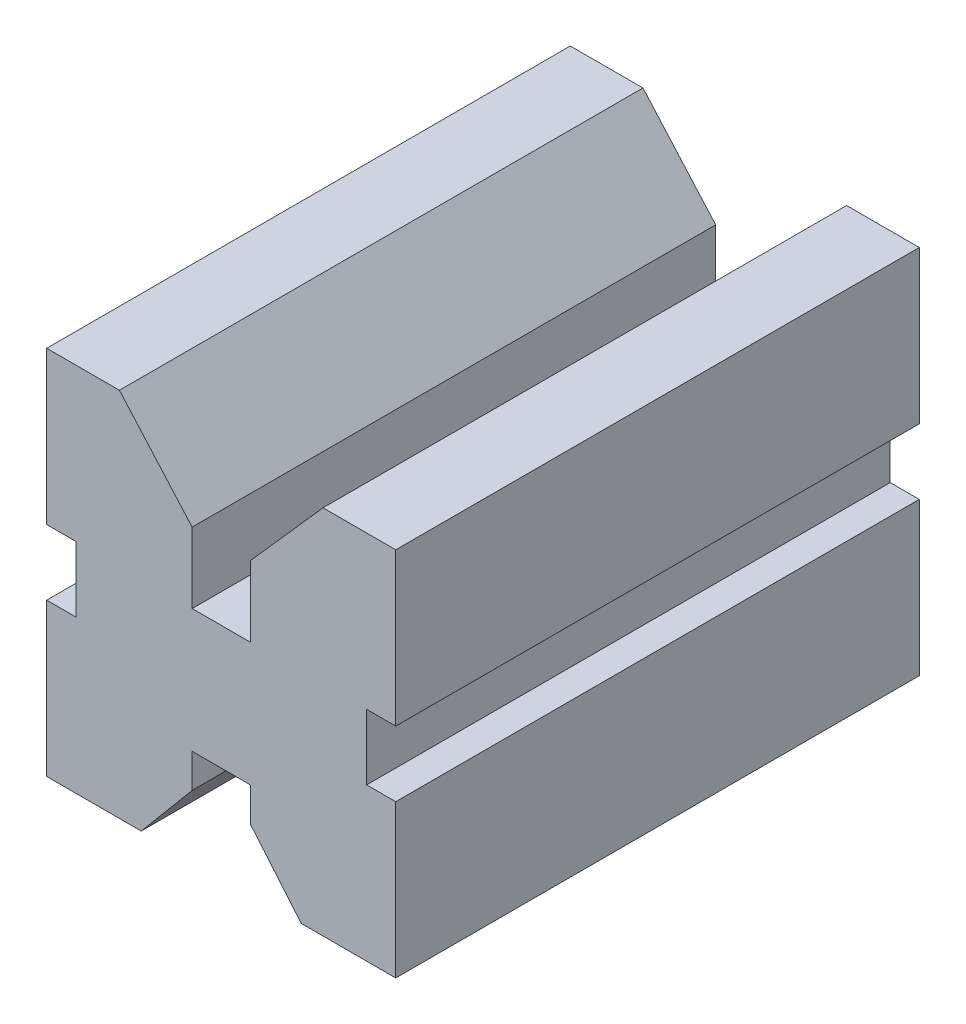
ISO-10303-21;
HEADER;
FILE_DESCRIPTION(('STEP AP214'),'2;1');
FILE_NAME('part.step','',(''),(''),'','','');
FILE_SCHEMA(('AUTOMOTIVE_DESIGN { 1 0 10303 214 1 1 1 1 }'));
ENDSEC;
DATA;
#1=APPLICATION_CONTEXT('core data for automotive mechanical design processes');
#2=APPLICATION_PROTOCOL_DEFINITION('international standard','automotive_design',2000,#1);
#3=PRODUCT_CONTEXT('',#1,'mechanical');
#4=PRODUCT('Part','Part','',(#3));
#5=PRODUCT_RELATED_PRODUCT_CATEGORY('part','',(#4));
#6=PRODUCT_DEFINITION_FORMATION('','',#4);
#7=PRODUCT_DEFINITION_CONTEXT('part definition',#1,'design');
#8=PRODUCT_DEFINITION('design','',#6,#7);
#9=PRODUCT_DEFINITION_SHAPE('','',#8);
#10=(LENGTH_UNIT() NAMED_UNIT(*) SI_UNIT(.MILLI.,.METRE.));
#11=(NAMED_UNIT(*) PLANE_ANGLE_UNIT() SI_UNIT($,.RADIAN.));
#12=(NAMED_UNIT(*) SI_UNIT($,.STERADIAN.) SOLID_ANGLE_UNIT());
#13=UNCERTAINTY_MEASURE_WITH_UNIT(LENGTH_MEASURE(1.E-05),#10,'distance_accuracy_value','');
#14=(GEOMETRIC_REPRESENTATION_CONTEXT(3) GLOBAL_UNCERTAINTY_ASSIGNED_CONTEXT((#13)) GLOBAL_UNIT_ASSIGNED_CONTEXT((#10,
#11,#12)) REPRESENTATION_CONTEXT('',''));
#15=CARTESIAN_POINT('',(0.,0.,0.));
#16=DIRECTION('',(0.,0.,1.));
#17=DIRECTION('',(1.,0.,0.));
#18=AXIS2_PLACEMENT_3D('',#15,#16,#17);
#19=CARTESIAN_POINT('',(4.,-25.5,36.));
#20=DIRECTION('',(0.,1.,0.));
#21=DIRECTION('',(0.,0.,1.));
#22=AXIS2_PLACEMENT_3D('',#19,#20,#21);
#23=PLANE('',#22);
#24=DIRECTION('',(0.,0.,1.));
#25=VECTOR('',#24,1.);
#26=CARTESIAN_POINT('',(11.,-25.5,-36.));
#27=LINE('',#26,#25);
#28=CARTESIAN_POINT('',(11.,-25.5,-36.));
#29=VERTEX_POINT('',#28);
#30=CARTESIAN_POINT('',(11.,-25.5,36.));
#31=VERTEX_POINT('',#30);
#32=EDGE_CURVE('E395',#29,#31,#27,.T.);
#33=ORIENTED_EDGE('',*,*,#32,.F.);
#34=DIRECTION('',(1.,0.,0.));
#35=VECTOR('',#34,1.);
#36=CARTESIAN_POINT('',(4.,-25.5,-36.));
#37=LINE('',#36,#35);
#38=CARTESIAN_POINT('',(24.,-25.5,-36.));
#39=VERTEX_POINT('',#38);
#40=EDGE_CURVE('E277',#29,#39,#37,.T.);
#41=ORIENTED_EDGE('',*,*,#40,.T.);
#42=DIRECTION('',(0.,0.,-1.));
#43=VECTOR('',#42,1.);
#44=CARTESIAN_POINT('',(24.,-25.5,36.));
#45=LINE('',#44,#43);
#46=CARTESIAN_POINT('',(24.,-25.5,36.));
#47=VERTEX_POINT('',#46);
#48=EDGE_CURVE('E301',#47,#39,#45,.T.);
#49=ORIENTED_EDGE('',*,*,#48,.F.);
#50=DIRECTION('',(1.,0.,0.));
#51=VECTOR('',#50,1.);
#52=CARTESIAN_POINT('',(4.,-25.5,36.));
#53=LINE('',#52,#51);
#54=EDGE_CURVE('E228',#31,#47,#53,.T.);
#55=ORIENTED_EDGE('',*,*,#54,.F.);
#56=EDGE_LOOP('',(#33,#41,#49,#55));
#57=FACE_BOUND('',#56,.T.);
#58=ADVANCED_FACE('F39',(#57),#23,.F.);
#59=CARTESIAN_POINT('',(-24.,25.5,36.));
#60=DIRECTION('',(0.,-1.,0.));
#61=DIRECTION('',(1.,0.,0.));
#62=AXIS2_PLACEMENT_3D('',#59,#60,#61);
#63=PLANE('',#62);
#64=DIRECTION('',(0.,0.,1.));
#65=VECTOR('',#64,1.);
#66=CARTESIAN_POINT('',(-14.,25.5,-36.));
#67=LINE('',#66,#65);
#68=CARTESIAN_POINT('',(-14.,25.5,-36.));
#69=VERTEX_POINT('',#68);
#70=CARTESIAN_POINT('',(-14.,25.5,36.));
#71=VERTEX_POINT('',#70);
#72=EDGE_CURVE('E354',#69,#71,#67,.T.);
#73=ORIENTED_EDGE('',*,*,#72,.F.);
#74=DIRECTION('',(-1.,0.,0.));
#75=VECTOR('',#74,1.);
#76=CARTESIAN_POINT('',(-24.,25.5,-36.));
#77=LINE('',#76,#75);
#78=CARTESIAN_POINT('',(-24.,25.5,-36.));
#79=VERTEX_POINT('',#78);
#80=EDGE_CURVE('E255',#69,#79,#77,.T.);
#81=ORIENTED_EDGE('',*,*,#80,.T.);
#82=DIRECTION('',(0.,0.,-1.));
#83=VECTOR('',#82,1.);
#84=CARTESIAN_POINT('',(-24.,25.5,36.));
#85=LINE('',#84,#83);
#86=CARTESIAN_POINT('',(-24.,25.5,36.));
#87=VERTEX_POINT('',#86);
#88=EDGE_CURVE('E324',#87,#79,#85,.T.);
#89=ORIENTED_EDGE('',*,*,#88,.F.);
#90=DIRECTION('',(-1.,0.,0.));
#91=VECTOR('',#90,1.);
#92=CARTESIAN_POINT('',(-24.,25.5,36.));
#93=LINE('',#92,#91);
#94=EDGE_CURVE('E373',#71,#87,#93,.T.);
#95=ORIENTED_EDGE('',*,*,#94,.F.);
#96=EDGE_LOOP('',(#73,#81,#89,#95));
#97=FACE_BOUND('',#96,.T.);
#98=ADVANCED_FACE('F454',(#97),#63,.F.);
#99=CARTESIAN_POINT('',(4.,25.5,36.));
#100=DIRECTION('',(0.,-1.,0.));
#101=DIRECTION('',(1.,0.,0.));
#102=AXIS2_PLACEMENT_3D('',#99,#100,#101);
#103=PLANE('',#102);
#104=DIRECTION('',(-1.,0.,0.));
#105=VECTOR('',#104,1.);
#106=CARTESIAN_POINT('',(4.,25.5,-36.));
#107=LINE('',#106,#105);
#108=CARTESIAN_POINT('',(24.,25.5,-36.));
#109=VERTEX_POINT('',#108);
#110=CARTESIAN_POINT('',(14.,25.5,-36.));
#111=VERTEX_POINT('',#110);
#112=EDGE_CURVE('E244',#109,#111,#107,.T.);
#113=ORIENTED_EDGE('',*,*,#112,.T.);
#114=DIRECTION('',(0.,0.,1.));
#115=VECTOR('',#114,1.);
#116=CARTESIAN_POINT('',(14.,25.5,-36.));
#117=LINE('',#116,#115);
#118=CARTESIAN_POINT('',(14.,25.5,36.));
#119=VERTEX_POINT('',#118);
#120=EDGE_CURVE('E250',#111,#119,#117,.T.);
#121=ORIENTED_EDGE('',*,*,#120,.T.);
#122=DIRECTION('',(-1.,0.,0.));
#123=VECTOR('',#122,1.);
#124=CARTESIAN_POINT('',(4.,25.5,36.));
#125=LINE('',#124,#123);
#126=CARTESIAN_POINT('',(24.,25.5,36.));
#127=VERTEX_POINT('',#126);
#128=EDGE_CURVE('E286',#127,#119,#125,.T.);
#129=ORIENTED_EDGE('',*,*,#128,.F.);
#130=DIRECTION('',(0.,0.,-1.));
#131=VECTOR('',#130,1.);
#132=CARTESIAN_POINT('',(24.,25.5,36.));
#133=LINE('',#132,#131);
#134=EDGE_CURVE('E245',#127,#109,#133,.T.);
#135=ORIENTED_EDGE('',*,*,#134,.T.);
#136=EDGE_LOOP('',(#113,#121,#129,#135));
#137=FACE_BOUND('',#136,.T.);
#138=ADVANCED_FACE('F41',(#137),#103,.F.);
#139=CARTESIAN_POINT('',(4.,25.5,36.));
#140=DIRECTION('',(1.,0.,0.));
#141=DIRECTION('',(0.,1.,0.));
#142=AXIS2_PLACEMENT_3D('',#139,#140,#141);
#143=PLANE('',#142);
#144=DIRECTION('',(0.,-1.,0.));
#145=VECTOR('',#144,1.);
#146=CARTESIAN_POINT('',(4.,25.5,36.));
#147=LINE('',#146,#145);
#148=CARTESIAN_POINT('',(4.,14.1970561363824,36.));
#149=VERTEX_POINT('',#148);
#150=CARTESIAN_POINT('',(4.,4.49999999999999,36.));
#151=VERTEX_POINT('',#150);
#152=EDGE_CURVE('E366',#149,#151,#147,.T.);
#153=ORIENTED_EDGE('',*,*,#152,.F.);
#154=DIRECTION('',(0.,0.,1.));
#155=VECTOR('',#154,1.);
#156=CARTESIAN_POINT('',(4.,14.1970561363824,-36.));
#157=LINE('',#156,#155);
#158=CARTESIAN_POINT('',(4.,14.1970561363824,-36.));
#159=VERTEX_POINT('',#158);
#160=EDGE_CURVE('E363',#159,#149,#157,.T.);
#161=ORIENTED_EDGE('',*,*,#160,.F.);
#162=DIRECTION('',(0.,-1.,0.));
#163=VECTOR('',#162,1.);
#164=CARTESIAN_POINT('',(4.,25.5,-36.));
#165=LINE('',#164,#163);
#166=CARTESIAN_POINT('',(4.,4.49999999999999,-36.));
#167=VERTEX_POINT('',#166);
#168=EDGE_CURVE('E248',#159,#167,#165,.T.);
#169=ORIENTED_EDGE('',*,*,#168,.T.);
#170=DIRECTION('',(0.,0.,-1.));
#171=VECTOR('',#170,1.);
#172=CARTESIAN_POINT('',(4.,4.49999999999999,36.));
#173=LINE('',#172,#171);
#174=EDGE_CURVE('E11',#151,#167,#173,.T.);
#175=ORIENTED_EDGE('',*,*,#174,.F.);
#176=EDGE_LOOP('',(#153,#161,#169,#175));
#177=FACE_BOUND('',#176,.T.);
#178=ADVANCED_FACE('F446',(#177),#143,.F.);
#179=CARTESIAN_POINT('',(-4.,4.49999999999999,36.));
#180=DIRECTION('',(0.,-1.,0.));
#181=DIRECTION('',(1.,0.,0.));
#182=AXIS2_PLACEMENT_3D('',#179,#180,#181);
#183=PLANE('',#182);
#184=DIRECTION('',(-1.,0.,0.));
#185=VECTOR('',#184,1.);
#186=CARTESIAN_POINT('',(-4.,4.49999999999999,-36.));
#187=LINE('',#186,#185);
#188=CARTESIAN_POINT('',(-4.,4.49999999999999,-36.));
#189=VERTEX_POINT('',#188);
#190=EDGE_CURVE('E249',#167,#189,#187,.T.);
#191=ORIENTED_EDGE('',*,*,#190,.T.);
#192=DIRECTION('',(0.,0.,-1.));
#193=VECTOR('',#192,1.);
#194=CARTESIAN_POINT('',(-4.,4.49999999999999,36.));
#195=LINE('',#194,#193);
#196=CARTESIAN_POINT('',(-4.,4.49999999999999,36.));
#197=VERTEX_POINT('',#196);
#198=EDGE_CURVE('E50',#197,#189,#195,.T.);
#199=ORIENTED_EDGE('',*,*,#198,.F.);
#200=DIRECTION('',(-1.,0.,0.));
#201=VECTOR('',#200,1.);
#202=CARTESIAN_POINT('',(-4.,4.49999999999999,36.));
#203=LINE('',#202,#201);
#204=EDGE_CURVE('E367',#151,#197,#203,.T.);
#205=ORIENTED_EDGE('',*,*,#204,.F.);
#206=ORIENTED_EDGE('',*,*,#174,.T.);
#207=EDGE_LOOP('',(#191,#199,#205,#206));
#208=FACE_BOUND('',#207,.T.);
#209=ADVANCED_FACE('F448',(#208),#183,.F.);
#210=CARTESIAN_POINT('',(-4.,25.5,36.));
#211=DIRECTION('',(-1.,0.,0.));
#212=DIRECTION('',(0.,-1.,0.));
#213=AXIS2_PLACEMENT_3D('',#210,#211,#212);
#214=PLANE('',#213);
#215=DIRECTION('',(0.,1.,0.));
#216=VECTOR('',#215,1.);
#217=CARTESIAN_POINT('',(-4.,25.5,-36.));
#218=LINE('',#217,#216);
#219=CARTESIAN_POINT('',(-4.,14.1970561363824,-36.));
#220=VERTEX_POINT('',#219);
#221=EDGE_CURVE('E253',#189,#220,#218,.T.);
#222=ORIENTED_EDGE('',*,*,#221,.T.);
#223=DIRECTION('',(0.,0.,1.));
#224=VECTOR('',#223,1.);
#225=CARTESIAN_POINT('',(-4.,14.1970561363824,-36.));
#226=LINE('',#225,#224);
#227=CARTESIAN_POINT('',(-4.,14.1970561363824,36.));
#228=VERTEX_POINT('',#227);
#229=EDGE_CURVE('E361',#220,#228,#226,.T.);
#230=ORIENTED_EDGE('',*,*,#229,.T.);
#231=DIRECTION('',(0.,1.,0.));
#232=VECTOR('',#231,1.);
#233=CARTESIAN_POINT('',(-4.,25.5,36.));
#234=LINE('',#233,#232);
#235=EDGE_CURVE('E333',#197,#228,#234,.T.);
#236=ORIENTED_EDGE('',*,*,#235,.F.);
#237=ORIENTED_EDGE('',*,*,#198,.T.);
#238=EDGE_LOOP('',(#222,#230,#236,#237));
#239=FACE_BOUND('',#238,.T.);
#240=ADVANCED_FACE('F335',(#239),#214,.F.);
#241=CARTESIAN_POINT('',(-24.,4.5,36.));
#242=DIRECTION('',(1.,0.,0.));
#243=DIRECTION('',(0.,1.,0.));
#244=AXIS2_PLACEMENT_3D('',#241,#242,#243);
#245=PLANE('',#244);
#246=DIRECTION('',(0.,-1.,0.));
#247=VECTOR('',#246,1.);
#248=CARTESIAN_POINT('',(-24.,4.5,-36.));
#249=LINE('',#248,#247);
#250=CARTESIAN_POINT('',(-24.,4.5,-36.));
#251=VERTEX_POINT('',#250);
#252=EDGE_CURVE('E258',#79,#251,#249,.T.);
#253=ORIENTED_EDGE('',*,*,#252,.T.);
#254=DIRECTION('',(0.,0.,-1.));
#255=VECTOR('',#254,1.);
#256=CARTESIAN_POINT('',(-24.,4.5,36.));
#257=LINE('',#256,#255);
#258=CARTESIAN_POINT('',(-24.,4.5,36.));
#259=VERTEX_POINT('',#258);
#260=EDGE_CURVE('E325',#259,#251,#257,.T.);
#261=ORIENTED_EDGE('',*,*,#260,.F.);
#262=DIRECTION('',(0.,-1.,0.));
#263=VECTOR('',#262,1.);
#264=CARTESIAN_POINT('',(-24.,4.5,36.));
#265=LINE('',#264,#263);
#266=EDGE_CURVE('E374',#87,#259,#265,.T.);
#267=ORIENTED_EDGE('',*,*,#266,.F.);
#268=ORIENTED_EDGE('',*,*,#88,.T.);
#269=EDGE_LOOP('',(#253,#261,#267,#268));
#270=FACE_BOUND('',#269,.T.);
#271=ADVANCED_FACE('F456',(#270),#245,.F.);
#272=CARTESIAN_POINT('',(-24.,4.5,36.));
#273=DIRECTION('',(0.,1.,0.));
#274=DIRECTION('',(-1.,0.,0.));
#275=AXIS2_PLACEMENT_3D('',#272,#273,#274);
#276=PLANE('',#275);
#277=DIRECTION('',(1.,0.,0.));
#278=VECTOR('',#277,1.);
#279=CARTESIAN_POINT('',(-24.,4.5,-36.));
#280=LINE('',#279,#278);
#281=CARTESIAN_POINT('',(-20.,4.5,-36.));
#282=VERTEX_POINT('',#281);
#283=EDGE_CURVE('E256',#251,#282,#280,.T.);
#284=ORIENTED_EDGE('',*,*,#283,.T.);
#285=DIRECTION('',(0.,0.,-1.));
#286=VECTOR('',#285,1.);
#287=CARTESIAN_POINT('',(-20.,4.5,36.));
#288=LINE('',#287,#286);
#289=CARTESIAN_POINT('',(-20.,4.5,36.));
#290=VERTEX_POINT('',#289);
#291=EDGE_CURVE('E317',#290,#282,#288,.T.);
#292=ORIENTED_EDGE('',*,*,#291,.F.);
#293=DIRECTION('',(1.,0.,0.));
#294=VECTOR('',#293,1.);
#295=CARTESIAN_POINT('',(-24.,4.5,36.));
#296=LINE('',#295,#294);
#297=EDGE_CURVE('E380',#259,#290,#296,.T.);
#298=ORIENTED_EDGE('',*,*,#297,.F.);
#299=ORIENTED_EDGE('',*,*,#260,.T.);
#300=EDGE_LOOP('',(#284,#292,#298,#299));
#301=FACE_BOUND('',#300,.T.);
#302=ADVANCED_FACE('F461',(#301),#276,.F.);
#303=CARTESIAN_POINT('',(-20.,4.5,36.));
#304=DIRECTION('',(1.,0.,0.));
#305=DIRECTION('',(0.,0.,-1.));
#306=AXIS2_PLACEMENT_3D('',#303,#304,#305);
#307=PLANE('',#306);
#308=DIRECTION('',(0.,-1.,0.));
#309=VECTOR('',#308,1.);
#310=CARTESIAN_POINT('',(-20.,4.5,-36.));
#311=LINE('',#310,#309);
#312=CARTESIAN_POINT('',(-20.,-4.5,-36.));
#313=VERTEX_POINT('',#312);
#314=EDGE_CURVE('E257',#282,#313,#311,.T.);
#315=ORIENTED_EDGE('',*,*,#314,.T.);
#316=DIRECTION('',(0.,0.,-1.));
#317=VECTOR('',#316,1.);
#318=CARTESIAN_POINT('',(-20.,-4.5,36.));
#319=LINE('',#318,#317);
#320=CARTESIAN_POINT('',(-20.,-4.5,36.));
#321=VERTEX_POINT('',#320);
#322=EDGE_CURVE('E316',#321,#313,#319,.T.);
#323=ORIENTED_EDGE('',*,*,#322,.F.);
#324=DIRECTION('',(0.,-1.,0.));
#325=VECTOR('',#324,1.);
#326=CARTESIAN_POINT('',(-20.,4.5,36.));
#327=LINE('',#326,#325);
#328=EDGE_CURVE('E377',#290,#321,#327,.T.);
#329=ORIENTED_EDGE('',*,*,#328,.F.);
#330=ORIENTED_EDGE('',*,*,#291,.T.);
#331=EDGE_LOOP('',(#315,#323,#329,#330));
#332=FACE_BOUND('',#331,.T.);
#333=ADVANCED_FACE('F466',(#332),#307,.F.);
#334=CARTESIAN_POINT('',(-24.,-4.5,36.));
#335=DIRECTION('',(0.,-1.,0.));
#336=DIRECTION('',(1.,0.,0.));
#337=AXIS2_PLACEMENT_3D('',#334,#335,#336);
#338=PLANE('',#337);
#339=DIRECTION('',(-1.,0.,0.));
#340=VECTOR('',#339,1.);
#341=CARTESIAN_POINT('',(-24.,-4.5,-36.));
#342=LINE('',#341,#340);
#343=CARTESIAN_POINT('',(-24.,-4.5,-36.));
#344=VERTEX_POINT('',#343);
#345=EDGE_CURVE('E265',#313,#344,#342,.T.);
#346=ORIENTED_EDGE('',*,*,#345,.T.);
#347=DIRECTION('',(0.,0.,-1.));
#348=VECTOR('',#347,1.);
#349=CARTESIAN_POINT('',(-24.,-4.5,36.));
#350=LINE('',#349,#348);
#351=CARTESIAN_POINT('',(-24.,-4.5,36.));
#352=VERTEX_POINT('',#351);
#353=EDGE_CURVE('E311',#352,#344,#350,.T.);
#354=ORIENTED_EDGE('',*,*,#353,.F.);
#355=DIRECTION('',(-1.,0.,0.));
#356=VECTOR('',#355,1.);
#357=CARTESIAN_POINT('',(-24.,-4.5,36.));
#358=LINE('',#357,#356);
#359=EDGE_CURVE('E381',#321,#352,#358,.T.);
#360=ORIENTED_EDGE('',*,*,#359,.F.);
#361=ORIENTED_EDGE('',*,*,#322,.T.);
#362=EDGE_LOOP('',(#346,#354,#360,#361));
#363=FACE_BOUND('',#362,.T.);
#364=ADVANCED_FACE('F473',(#363),#338,.F.);
#365=CARTESIAN_POINT('',(-24.,-25.5,36.));
#366=DIRECTION('',(1.,0.,0.));
#367=DIRECTION('',(0.,1.,0.));
#368=AXIS2_PLACEMENT_3D('',#365,#366,#367);
#369=PLANE('',#368);
#370=DIRECTION('',(0.,-1.,0.));
#371=VECTOR('',#370,1.);
#372=CARTESIAN_POINT('',(-24.,-25.5,-36.));
#373=LINE('',#372,#371);
#374=CARTESIAN_POINT('',(-24.,-25.5,-36.));
#375=VERTEX_POINT('',#374);
#376=EDGE_CURVE('E262',#344,#375,#373,.T.);
#377=ORIENTED_EDGE('',*,*,#376,.T.);
#378=DIRECTION('',(0.,0.,-1.));
#379=VECTOR('',#378,1.);
#380=CARTESIAN_POINT('',(-24.,-25.5,36.));
#381=LINE('',#380,#379);
#382=CARTESIAN_POINT('',(-24.,-25.5,36.));
#383=VERTEX_POINT('',#382);
#384=EDGE_CURVE('E309',#383,#375,#381,.T.);
#385=ORIENTED_EDGE('',*,*,#384,.F.);
#386=DIRECTION('',(0.,-1.,0.));
#387=VECTOR('',#386,1.);
#388=CARTESIAN_POINT('',(-24.,-25.5,36.));
#389=LINE('',#388,#387);
#390=EDGE_CURVE('E221',#352,#383,#389,.T.);
#391=ORIENTED_EDGE('',*,*,#390,.F.);
#392=ORIENTED_EDGE('',*,*,#353,.T.);
#393=EDGE_LOOP('',(#377,#385,#391,#392));
#394=FACE_BOUND('',#393,.T.);
#395=ADVANCED_FACE('F390',(#394),#369,.F.);
#396=CARTESIAN_POINT('',(-24.,-25.5,36.));
#397=DIRECTION('',(0.,1.,0.));
#398=DIRECTION('',(0.,0.,1.));
#399=AXIS2_PLACEMENT_3D('',#396,#397,#398);
#400=PLANE('',#399);
#401=DIRECTION('',(1.,0.,0.));
#402=VECTOR('',#401,1.);
#403=CARTESIAN_POINT('',(-24.,-25.5,-36.));
#404=LINE('',#403,#402);
#405=CARTESIAN_POINT('',(-11.,-25.5,-36.));
#406=VERTEX_POINT('',#405);
#407=EDGE_CURVE('E266',#375,#406,#404,.T.);
#408=ORIENTED_EDGE('',*,*,#407,.T.);
#409=DIRECTION('',(0.,0.,1.));
#410=VECTOR('',#409,1.);
#411=CARTESIAN_POINT('',(-11.,-25.5,-36.));
#412=LINE('',#411,#410);
#413=CARTESIAN_POINT('',(-11.,-25.5,36.));
#414=VERTEX_POINT('',#413);
#415=EDGE_CURVE('E202',#406,#414,#412,.T.);
#416=ORIENTED_EDGE('',*,*,#415,.T.);
#417=DIRECTION('',(1.,0.,0.));
#418=VECTOR('',#417,1.);
#419=CARTESIAN_POINT('',(-24.,-25.5,36.));
#420=LINE('',#419,#418);
#421=EDGE_CURVE('E212',#383,#414,#420,.T.);
#422=ORIENTED_EDGE('',*,*,#421,.F.);
#423=ORIENTED_EDGE('',*,*,#384,.T.);
#424=EDGE_LOOP('',(#408,#416,#422,#423));
#425=FACE_BOUND('',#424,.T.);
#426=ADVANCED_FACE('F392',(#425),#400,.F.);
#427=CARTESIAN_POINT('',(-4.,-25.5,36.));
#428=DIRECTION('',(-1.,0.,0.));
#429=DIRECTION('',(0.,0.,1.));
#430=AXIS2_PLACEMENT_3D('',#427,#428,#429);
#431=PLANE('',#430);
#432=DIRECTION('',(0.,1.,0.));
#433=VECTOR('',#432,1.);
#434=CARTESIAN_POINT('',(-4.,-25.5,36.));
#435=LINE('',#434,#433);
#436=CARTESIAN_POINT('',(-4.,-17.1577248518406,36.));
#437=VERTEX_POINT('',#436);
#438=CARTESIAN_POINT('',(-4.,-12.5,36.));
#439=VERTEX_POINT('',#438);
#440=EDGE_CURVE('E211',#437,#439,#435,.T.);
#441=ORIENTED_EDGE('',*,*,#440,.F.);
#442=DIRECTION('',(0.,0.,1.));
#443=VECTOR('',#442,1.);
#444=CARTESIAN_POINT('',(-4.,-17.1577248518406,-36.));
#445=LINE('',#444,#443);
#446=CARTESIAN_POINT('',(-4.,-17.1577248518406,-36.));
#447=VERTEX_POINT('',#446);
#448=EDGE_CURVE('E197',#447,#437,#445,.T.);
#449=ORIENTED_EDGE('',*,*,#448,.F.);
#450=DIRECTION('',(0.,1.,0.));
#451=VECTOR('',#450,1.);
#452=CARTESIAN_POINT('',(-4.,-25.5,-36.));
#453=LINE('',#452,#451);
#454=CARTESIAN_POINT('',(-4.,-12.5,-36.));
#455=VERTEX_POINT('',#454);
#456=EDGE_CURVE('E267',#447,#455,#453,.T.);
#457=ORIENTED_EDGE('',*,*,#456,.T.);
#458=DIRECTION('',(0.,0.,-1.));
#459=VECTOR('',#458,1.);
#460=CARTESIAN_POINT('',(-4.,-12.5,36.));
#461=LINE('',#460,#459);
#462=EDGE_CURVE('E217',#439,#455,#461,.T.);
#463=ORIENTED_EDGE('',*,*,#462,.F.);
#464=EDGE_LOOP('',(#441,#449,#457,#463));
#465=FACE_BOUND('',#464,.T.);
#466=ADVANCED_FACE('F216',(#465),#431,.F.);
#467=CARTESIAN_POINT('',(-4.,-12.5,36.));
#468=DIRECTION('',(0.,1.,0.));
#469=DIRECTION('',(0.,0.,1.));
#470=AXIS2_PLACEMENT_3D('',#467,#468,#469);
#471=PLANE('',#470);
#472=DIRECTION('',(1.,0.,0.));
#473=VECTOR('',#472,1.);
#474=CARTESIAN_POINT('',(-4.,-12.5,-36.));
#475=LINE('',#474,#473);
#476=CARTESIAN_POINT('',(4.,-12.5,-36.));
#477=VERTEX_POINT('',#476);
#478=EDGE_CURVE('E271',#455,#477,#475,.T.);
#479=ORIENTED_EDGE('',*,*,#478,.T.);
#480=DIRECTION('',(0.,0.,-1.));
#481=VECTOR('',#480,1.);
#482=CARTESIAN_POINT('',(4.,-12.5,36.));
#483=LINE('',#482,#481);
#484=CARTESIAN_POINT('',(4.,-12.5,36.));
#485=VERTEX_POINT('',#484);
#486=EDGE_CURVE('E308',#485,#477,#483,.T.);
#487=ORIENTED_EDGE('',*,*,#486,.F.);
#488=DIRECTION('',(1.,0.,0.));
#489=VECTOR('',#488,1.);
#490=CARTESIAN_POINT('',(-4.,-12.5,36.));
#491=LINE('',#490,#489);
#492=EDGE_CURVE('E219',#439,#485,#491,.T.);
#493=ORIENTED_EDGE('',*,*,#492,.F.);
#494=ORIENTED_EDGE('',*,*,#462,.T.);
#495=EDGE_LOOP('',(#479,#487,#493,#494));
#496=FACE_BOUND('',#495,.T.);
#497=ADVANCED_FACE('F410',(#496),#471,.F.);
#498=CARTESIAN_POINT('',(4.,-25.5,36.));
#499=DIRECTION('',(1.,0.,0.));
#500=DIRECTION('',(0.,0.,-1.));
#501=AXIS2_PLACEMENT_3D('',#498,#499,#500);
#502=PLANE('',#501);
#503=DIRECTION('',(0.,-1.,0.));
#504=VECTOR('',#503,1.);
#505=CARTESIAN_POINT('',(4.,-25.5,-36.));
#506=LINE('',#505,#504);
#507=CARTESIAN_POINT('',(4.00000000000001,-17.1577248518406,-36.));
#508=VERTEX_POINT('',#507);
#509=EDGE_CURVE('E272',#477,#508,#506,.T.);
#510=ORIENTED_EDGE('',*,*,#509,.T.);
#511=DIRECTION('',(0.,0.,1.));
#512=VECTOR('',#511,1.);
#513=CARTESIAN_POINT('',(4.00000000000001,-17.1577248518406,-36.));
#514=LINE('',#513,#512);
#515=CARTESIAN_POINT('',(4.,-17.1577248518406,36.));
#516=VERTEX_POINT('',#515);
#517=EDGE_CURVE('E391',#508,#516,#514,.T.);
#518=ORIENTED_EDGE('',*,*,#517,.T.);
#519=DIRECTION('',(0.,-1.,0.));
#520=VECTOR('',#519,1.);
#521=CARTESIAN_POINT('',(4.,-25.5,36.));
#522=LINE('',#521,#520);
#523=EDGE_CURVE('E225',#485,#516,#522,.T.);
#524=ORIENTED_EDGE('',*,*,#523,.F.);
#525=ORIENTED_EDGE('',*,*,#486,.T.);
#526=EDGE_LOOP('',(#510,#518,#524,#525));
#527=FACE_BOUND('',#526,.T.);
#528=ADVANCED_FACE('F408',(#527),#502,.F.);
#529=CARTESIAN_POINT('',(24.,-25.5,36.));
#530=DIRECTION('',(-1.,0.,0.));
#531=DIRECTION('',(0.,-1.,0.));
#532=AXIS2_PLACEMENT_3D('',#529,#530,#531);
#533=PLANE('',#532);
#534=DIRECTION('',(0.,1.,0.));
#535=VECTOR('',#534,1.);
#536=CARTESIAN_POINT('',(24.,-25.5,-36.));
#537=LINE('',#536,#535);
#538=CARTESIAN_POINT('',(24.,-4.5,-36.));
#539=VERTEX_POINT('',#538);
#540=EDGE_CURVE('E279',#39,#539,#537,.T.);
#541=ORIENTED_EDGE('',*,*,#540,.T.);
#542=DIRECTION('',(0.,0.,-1.));
#543=VECTOR('',#542,1.);
#544=CARTESIAN_POINT('',(24.,-4.5,36.));
#545=LINE('',#544,#543);
#546=CARTESIAN_POINT('',(24.,-4.5,36.));
#547=VERTEX_POINT('',#546);
#548=EDGE_CURVE('E298',#547,#539,#545,.T.);
#549=ORIENTED_EDGE('',*,*,#548,.F.);
#550=DIRECTION('',(0.,1.,0.));
#551=VECTOR('',#550,1.);
#552=CARTESIAN_POINT('',(24.,-25.5,36.));
#553=LINE('',#552,#551);
#554=EDGE_CURVE('E235',#47,#547,#553,.T.);
#555=ORIENTED_EDGE('',*,*,#554,.F.);
#556=ORIENTED_EDGE('',*,*,#48,.T.);
#557=EDGE_LOOP('',(#541,#549,#555,#556));
#558=FACE_BOUND('',#557,.T.);
#559=ADVANCED_FACE('F423',(#558),#533,.F.);
#560=CARTESIAN_POINT('',(24.,-4.5,36.));
#561=DIRECTION('',(0.,-1.,0.));
#562=DIRECTION('',(1.,0.,0.));
#563=AXIS2_PLACEMENT_3D('',#560,#561,#562);
#564=PLANE('',#563);
#565=DIRECTION('',(-1.,0.,0.));
#566=VECTOR('',#565,1.);
#567=CARTESIAN_POINT('',(24.,-4.5,-36.));
#568=LINE('',#567,#566);
#569=CARTESIAN_POINT('',(20.,-4.5,-36.));
#570=VERTEX_POINT('',#569);
#571=EDGE_CURVE('E278',#539,#570,#568,.T.);
#572=ORIENTED_EDGE('',*,*,#571,.T.);
#573=DIRECTION('',(0.,0.,-1.));
#574=VECTOR('',#573,1.);
#575=CARTESIAN_POINT('',(20.,-4.5,36.));
#576=LINE('',#575,#574);
#577=CARTESIAN_POINT('',(20.,-4.5,36.));
#578=VERTEX_POINT('',#577);
#579=EDGE_CURVE('E300',#578,#570,#576,.T.);
#580=ORIENTED_EDGE('',*,*,#579,.F.);
#581=DIRECTION('',(-1.,0.,0.));
#582=VECTOR('',#581,1.);
#583=CARTESIAN_POINT('',(24.,-4.5,36.));
#584=LINE('',#583,#582);
#585=EDGE_CURVE('E234',#547,#578,#584,.T.);
#586=ORIENTED_EDGE('',*,*,#585,.F.);
#587=ORIENTED_EDGE('',*,*,#548,.T.);
#588=EDGE_LOOP('',(#572,#580,#586,#587));
#589=FACE_BOUND('',#588,.T.);
#590=ADVANCED_FACE('F424',(#589),#564,.F.);
#591=CARTESIAN_POINT('',(20.,4.5,36.));
#592=DIRECTION('',(-1.,0.,0.));
#593=DIRECTION('',(0.,0.,1.));
#594=AXIS2_PLACEMENT_3D('',#591,#592,#593);
#595=PLANE('',#594);
#596=DIRECTION('',(0.,1.,0.));
#597=VECTOR('',#596,1.);
#598=CARTESIAN_POINT('',(20.,4.5,-36.));
#599=LINE('',#598,#597);
#600=CARTESIAN_POINT('',(20.,4.5,-36.));
#601=VERTEX_POINT('',#600);
#602=EDGE_CURVE('E285',#570,#601,#599,.T.);
#603=ORIENTED_EDGE('',*,*,#602,.T.);
#604=DIRECTION('',(0.,0.,-1.));
#605=VECTOR('',#604,1.);
#606=CARTESIAN_POINT('',(20.,4.5,36.));
#607=LINE('',#606,#605);
#608=CARTESIAN_POINT('',(20.,4.5,36.));
#609=VERTEX_POINT('',#608);
#610=EDGE_CURVE('E294',#609,#601,#607,.T.);
#611=ORIENTED_EDGE('',*,*,#610,.F.);
#612=DIRECTION('',(0.,1.,0.));
#613=VECTOR('',#612,1.);
#614=CARTESIAN_POINT('',(20.,4.5,36.));
#615=LINE('',#614,#613);
#616=EDGE_CURVE('E237',#578,#609,#615,.T.);
#617=ORIENTED_EDGE('',*,*,#616,.F.);
#618=ORIENTED_EDGE('',*,*,#579,.T.);
#619=EDGE_LOOP('',(#603,#611,#617,#618));
#620=FACE_BOUND('',#619,.T.);
#621=ADVANCED_FACE('F427',(#620),#595,.F.);
#622=CARTESIAN_POINT('',(24.,4.5,36.));
#623=DIRECTION('',(0.,1.,0.));
#624=DIRECTION('',(-1.,0.,0.));
#625=AXIS2_PLACEMENT_3D('',#622,#623,#624);
#626=PLANE('',#625);
#627=DIRECTION('',(1.,0.,0.));
#628=VECTOR('',#627,1.);
#629=CARTESIAN_POINT('',(24.,4.5,-36.));
#630=LINE('',#629,#628);
#631=CARTESIAN_POINT('',(24.,4.5,-36.));
#632=VERTEX_POINT('',#631);
#633=EDGE_CURVE('E281',#601,#632,#630,.T.);
#634=ORIENTED_EDGE('',*,*,#633,.T.);
#635=DIRECTION('',(0.,0.,-1.));
#636=VECTOR('',#635,1.);
#637=CARTESIAN_POINT('',(24.,4.5,36.));
#638=LINE('',#637,#636);
#639=CARTESIAN_POINT('',(24.,4.5,36.));
#640=VERTEX_POINT('',#639);
#641=EDGE_CURVE('E292',#640,#632,#638,.T.);
#642=ORIENTED_EDGE('',*,*,#641,.F.);
#643=DIRECTION('',(1.,0.,0.));
#644=VECTOR('',#643,1.);
#645=CARTESIAN_POINT('',(24.,4.5,36.));
#646=LINE('',#645,#644);
#647=EDGE_CURVE('E236',#609,#640,#646,.T.);
#648=ORIENTED_EDGE('',*,*,#647,.F.);
#649=ORIENTED_EDGE('',*,*,#610,.T.);
#650=EDGE_LOOP('',(#634,#642,#648,#649));
#651=FACE_BOUND('',#650,.T.);
#652=ADVANCED_FACE('F434',(#651),#626,.F.);
#653=CARTESIAN_POINT('',(24.,4.5,36.));
#654=DIRECTION('',(-1.,0.,0.));
#655=DIRECTION('',(0.,-1.,0.));
#656=AXIS2_PLACEMENT_3D('',#653,#654,#655);
#657=PLANE('',#656);
#658=DIRECTION('',(0.,1.,0.));
#659=VECTOR('',#658,1.);
#660=CARTESIAN_POINT('',(24.,4.5,-36.));
#661=LINE('',#660,#659);
#662=EDGE_CURVE('E288',#632,#109,#661,.T.);
#663=ORIENTED_EDGE('',*,*,#662,.T.);
#664=ORIENTED_EDGE('',*,*,#134,.F.);
#665=DIRECTION('',(0.,1.,0.));
#666=VECTOR('',#665,1.);
#667=CARTESIAN_POINT('',(24.,4.5,36.));
#668=LINE('',#667,#666);
#669=EDGE_CURVE('E238',#640,#127,#668,.T.);
#670=ORIENTED_EDGE('',*,*,#669,.F.);
#671=ORIENTED_EDGE('',*,*,#641,.T.);
#672=EDGE_LOOP('',(#663,#664,#670,#671));
#673=FACE_BOUND('',#672,.T.);
#674=ADVANCED_FACE('F438',(#673),#657,.F.);
#675=CARTESIAN_POINT('',(0.,0.,36.));
#676=DIRECTION('',(0.,0.,1.));
#677=DIRECTION('',(1.,0.,0.));
#678=AXIS2_PLACEMENT_3D('',#675,#676,#677);
#679=PLANE('',#678);
#680=DIRECTION('',(-0.64278760968654,-0.766044443118977,0.));
#681=VECTOR('',#680,1.);
#682=CARTESIAN_POINT('',(-4.,-17.1577248518406,36.));
#683=LINE('',#682,#681);
#684=EDGE_CURVE('E199',#437,#414,#683,.T.);
#685=ORIENTED_EDGE('',*,*,#684,.F.);
#686=ORIENTED_EDGE('',*,*,#440,.T.);
#687=ORIENTED_EDGE('',*,*,#492,.T.);
#688=ORIENTED_EDGE('',*,*,#523,.T.);
#689=DIRECTION('',(-0.642787609686541,0.766044443118977,0.));
#690=VECTOR('',#689,1.);
#691=CARTESIAN_POINT('',(4.00000000000001,-17.1577248518406,36.));
#692=LINE('',#691,#690);
#693=EDGE_CURVE('E53',#31,#516,#692,.T.);
#694=ORIENTED_EDGE('',*,*,#693,.F.);
#695=ORIENTED_EDGE('',*,*,#54,.T.);
#696=ORIENTED_EDGE('',*,*,#554,.T.);
#697=ORIENTED_EDGE('',*,*,#585,.T.);
#698=ORIENTED_EDGE('',*,*,#616,.T.);
#699=ORIENTED_EDGE('',*,*,#647,.T.);
#700=ORIENTED_EDGE('',*,*,#669,.T.);
#701=ORIENTED_EDGE('',*,*,#128,.T.);
#702=DIRECTION('',(0.662620048215736,0.748955720789003,0.));
#703=VECTOR('',#702,1.);
#704=CARTESIAN_POINT('',(4.,14.1970561363824,36.));
#705=LINE('',#704,#703);
#706=EDGE_CURVE('E348',#149,#119,#705,.T.);
#707=ORIENTED_EDGE('',*,*,#706,.F.);
#708=ORIENTED_EDGE('',*,*,#152,.T.);
#709=ORIENTED_EDGE('',*,*,#204,.T.);
#710=ORIENTED_EDGE('',*,*,#235,.T.);
#711=DIRECTION('',(0.662620048215736,-0.748955720789004,0.));
#712=VECTOR('',#711,1.);
#713=CARTESIAN_POINT('',(-14.,25.5,36.));
#714=LINE('',#713,#712);
#715=EDGE_CURVE('E353',#71,#228,#714,.T.);
#716=ORIENTED_EDGE('',*,*,#715,.F.);
#717=ORIENTED_EDGE('',*,*,#94,.T.);
#718=ORIENTED_EDGE('',*,*,#266,.T.);
#719=ORIENTED_EDGE('',*,*,#297,.T.);
#720=ORIENTED_EDGE('',*,*,#328,.T.);
#721=ORIENTED_EDGE('',*,*,#359,.T.);
#722=ORIENTED_EDGE('',*,*,#390,.T.);
#723=ORIENTED_EDGE('',*,*,#421,.T.);
#724=EDGE_LOOP('',(#685,#686,#687,#688,#694,#695,#696,#697,#698,#699,#700,#701,#707,#708,#709,
#710,#716,#717,#718,#719,#720,#721,#722,#723));
#725=FACE_BOUND('',#724,.T.);
#726=ADVANCED_FACE('F209',(#725),#679,.T.);
#727=CARTESIAN_POINT('',(0.,0.,-36.));
#728=DIRECTION('',(0.,0.,1.));
#729=DIRECTION('',(1.,0.,0.));
#730=AXIS2_PLACEMENT_3D('',#727,#728,#729);
#731=PLANE('',#730);
#732=ORIENTED_EDGE('',*,*,#40,.F.);
#733=DIRECTION('',(-0.642787609686541,0.766044443118977,0.));
#734=VECTOR('',#733,1.);
#735=CARTESIAN_POINT('',(4.00000000000001,-17.1577248518406,-36.));
#736=LINE('',#735,#734);
#737=EDGE_CURVE('E206',#29,#508,#736,.T.);
#738=ORIENTED_EDGE('',*,*,#737,.T.);
#739=ORIENTED_EDGE('',*,*,#509,.F.);
#740=ORIENTED_EDGE('',*,*,#478,.F.);
#741=ORIENTED_EDGE('',*,*,#456,.F.);
#742=DIRECTION('',(-0.64278760968654,-0.766044443118977,0.));
#743=VECTOR('',#742,1.);
#744=CARTESIAN_POINT('',(-4.,-17.1577248518406,-36.));
#745=LINE('',#744,#743);
#746=EDGE_CURVE('E65',#447,#406,#745,.T.);
#747=ORIENTED_EDGE('',*,*,#746,.T.);
#748=ORIENTED_EDGE('',*,*,#407,.F.);
#749=ORIENTED_EDGE('',*,*,#376,.F.);
#750=ORIENTED_EDGE('',*,*,#345,.F.);
#751=ORIENTED_EDGE('',*,*,#314,.F.);
#752=ORIENTED_EDGE('',*,*,#283,.F.);
#753=ORIENTED_EDGE('',*,*,#252,.F.);
#754=ORIENTED_EDGE('',*,*,#80,.F.);
#755=DIRECTION('',(0.662620048215736,-0.748955720789004,0.));
#756=VECTOR('',#755,1.);
#757=CARTESIAN_POINT('',(-14.,25.5,-36.));
#758=LINE('',#757,#756);
#759=EDGE_CURVE('E342',#69,#220,#758,.T.);
#760=ORIENTED_EDGE('',*,*,#759,.T.);
#761=ORIENTED_EDGE('',*,*,#221,.F.);
#762=ORIENTED_EDGE('',*,*,#190,.F.);
#763=ORIENTED_EDGE('',*,*,#168,.F.);
#764=DIRECTION('',(0.662620048215736,0.748955720789003,0.));
#765=VECTOR('',#764,1.);
#766=CARTESIAN_POINT('',(4.,14.1970561363824,-36.));
#767=LINE('',#766,#765);
#768=EDGE_CURVE('E349',#159,#111,#767,.T.);
#769=ORIENTED_EDGE('',*,*,#768,.T.);
#770=ORIENTED_EDGE('',*,*,#112,.F.);
#771=ORIENTED_EDGE('',*,*,#662,.F.);
#772=ORIENTED_EDGE('',*,*,#633,.F.);
#773=ORIENTED_EDGE('',*,*,#602,.F.);
#774=ORIENTED_EDGE('',*,*,#571,.F.);
#775=ORIENTED_EDGE('',*,*,#540,.F.);
#776=EDGE_LOOP('',(#732,#738,#739,#740,#741,#747,#748,#749,#750,#751,#752,#753,#754,#760,#761,
#762,#763,#769,#770,#771,#772,#773,#774,#775));
#777=FACE_BOUND('',#776,.T.);
#778=ADVANCED_FACE('F345',(#777),#731,.F.);
#779=CARTESIAN_POINT('',(-14.,25.5,-36.));
#780=DIRECTION('',(-0.748955720789004,-0.662620048215736,0.));
#781=DIRECTION('',(0.662620048215736,-0.748955720789004,0.));
#782=AXIS2_PLACEMENT_3D('',#779,#780,#781);
#783=PLANE('',#782);
#784=ORIENTED_EDGE('',*,*,#229,.F.);
#785=ORIENTED_EDGE('',*,*,#759,.F.);
#786=ORIENTED_EDGE('',*,*,#72,.T.);
#787=ORIENTED_EDGE('',*,*,#715,.T.);
#788=EDGE_LOOP('',(#784,#785,#786,#787));
#789=FACE_BOUND('',#788,.T.);
#790=ADVANCED_FACE('F527',(#789),#783,.F.);
#791=CARTESIAN_POINT('',(4.,14.1970561363824,-36.));
#792=DIRECTION('',(0.748955720789003,-0.662620048215736,0.));
#793=DIRECTION('',(0.662620048215736,0.748955720789003,0.));
#794=AXIS2_PLACEMENT_3D('',#791,#792,#793);
#795=PLANE('',#794);
#796=ORIENTED_EDGE('',*,*,#120,.F.);
#797=ORIENTED_EDGE('',*,*,#768,.F.);
#798=ORIENTED_EDGE('',*,*,#160,.T.);
#799=ORIENTED_EDGE('',*,*,#706,.T.);
#800=EDGE_LOOP('',(#796,#797,#798,#799));
#801=FACE_BOUND('',#800,.T.);
#802=ADVANCED_FACE('F536',(#801),#795,.F.);
#803=CARTESIAN_POINT('',(4.00000000000001,-17.1577248518406,-36.));
#804=DIRECTION('',(0.766044443118977,0.642787609686541,0.));
#805=DIRECTION('',(-0.642787609686541,0.766044443118977,0.));
#806=AXIS2_PLACEMENT_3D('',#803,#804,#805);
#807=PLANE('',#806);
#808=ORIENTED_EDGE('',*,*,#517,.F.);
#809=ORIENTED_EDGE('',*,*,#737,.F.);
#810=ORIENTED_EDGE('',*,*,#32,.T.);
#811=ORIENTED_EDGE('',*,*,#693,.T.);
#812=EDGE_LOOP('',(#808,#809,#810,#811));
#813=FACE_BOUND('',#812,.T.);
#814=ADVANCED_FACE('F411',(#813),#807,.F.);
#815=CARTESIAN_POINT('',(-4.,-17.1577248518406,-36.));
#816=DIRECTION('',(-0.766044443118977,0.64278760968654,0.));
#817=DIRECTION('',(-0.64278760968654,-0.766044443118977,0.));
#818=AXIS2_PLACEMENT_3D('',#815,#816,#817);
#819=PLANE('',#818);
#820=ORIENTED_EDGE('',*,*,#415,.F.);
#821=ORIENTED_EDGE('',*,*,#746,.F.);
#822=ORIENTED_EDGE('',*,*,#448,.T.);
#823=ORIENTED_EDGE('',*,*,#684,.T.);
#824=EDGE_LOOP('',(#820,#821,#822,#823));
#825=FACE_BOUND('',#824,.T.);
#826=ADVANCED_FACE('F200',(#825),#819,.F.);
#827=CLOSED_SHELL('',(#58,#98,#138,#178,#209,#240,#271,#302,#333,#364,#395,#426,#466,#497,#528,
#559,#590,#621,#652,#674,#726,#778,#790,#802,#814,#826));
#828=MANIFOLD_SOLID_BREP('B2',#827);
#829=ADVANCED_BREP_SHAPE_REPRESENTATION('',(#18,#828),#14);
#830=SHAPE_DEFINITION_REPRESENTATION(#9,#829);
ENDSEC;
END-ISO-10303-21;
